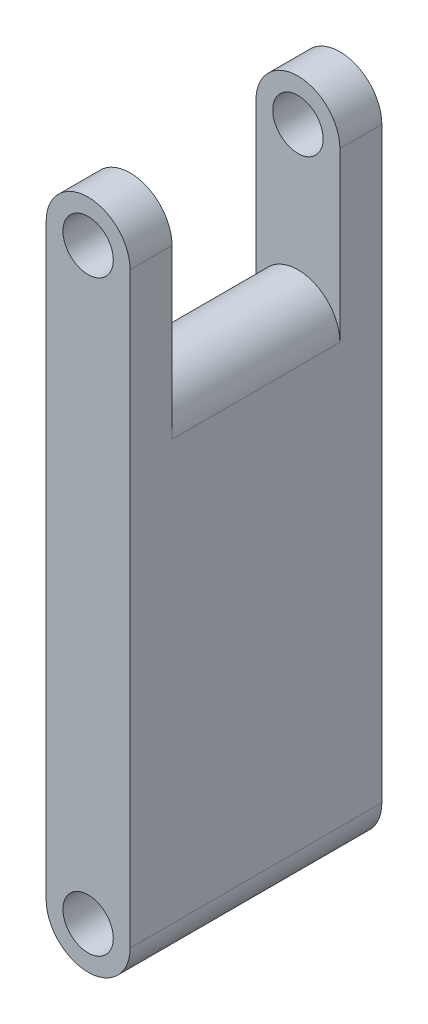
ISO-10303-21;
HEADER;
FILE_DESCRIPTION(('STEP AP214'),'2;1');
FILE_NAME('part.step','',(''),(''),'','','');
FILE_SCHEMA(('AUTOMOTIVE_DESIGN { 1 0 10303 214 1 1 1 1 }'));
ENDSEC;
DATA;
#1=APPLICATION_CONTEXT('core data for automotive mechanical design processes');
#2=APPLICATION_PROTOCOL_DEFINITION('international standard','automotive_design',2000,#1);
#3=PRODUCT_CONTEXT('',#1,'mechanical');
#4=PRODUCT('Part','Part','',(#3));
#5=PRODUCT_RELATED_PRODUCT_CATEGORY('part','',(#4));
#6=PRODUCT_DEFINITION_FORMATION('','',#4);
#7=PRODUCT_DEFINITION_CONTEXT('part definition',#1,'design');
#8=PRODUCT_DEFINITION('design','',#6,#7);
#9=PRODUCT_DEFINITION_SHAPE('','',#8);
#10=(LENGTH_UNIT() NAMED_UNIT(*) SI_UNIT(.MILLI.,.METRE.));
#11=(NAMED_UNIT(*) PLANE_ANGLE_UNIT() SI_UNIT($,.RADIAN.));
#12=(NAMED_UNIT(*) SI_UNIT($,.STERADIAN.) SOLID_ANGLE_UNIT());
#13=UNCERTAINTY_MEASURE_WITH_UNIT(LENGTH_MEASURE(1.E-05),#10,'distance_accuracy_value','');
#14=(GEOMETRIC_REPRESENTATION_CONTEXT(3) GLOBAL_UNCERTAINTY_ASSIGNED_CONTEXT((#13)) GLOBAL_UNIT_ASSIGNED_CONTEXT((#10,
#11,#12)) REPRESENTATION_CONTEXT('',''));
#15=CARTESIAN_POINT('',(0.,0.,0.));
#16=DIRECTION('',(0.,0.,1.));
#17=DIRECTION('',(1.,0.,0.));
#18=AXIS2_PLACEMENT_3D('',#15,#16,#17);
#19=CARTESIAN_POINT('',(0.,19.05,19.05));
#20=DIRECTION('',(0.,0.,1.));
#21=DIRECTION('',(1.,0.,0.));
#22=AXIS2_PLACEMENT_3D('',#19,#20,#21);
#23=CYLINDRICAL_SURFACE('',#22,6.35);
#24=DIRECTION('',(0.,0.,1.));
#25=VECTOR('',#24,1.);
#26=CARTESIAN_POINT('',(-6.35,19.05,19.05));
#27=LINE('',#26,#25);
#28=CARTESIAN_POINT('',(-6.35,19.05,12.7));
#29=VERTEX_POINT('',#28);
#30=CARTESIAN_POINT('',(-6.35,19.05,-12.7));
#31=VERTEX_POINT('',#30);
#32=EDGE_CURVE('E134',#29,#31,#27,.F.);
#33=ORIENTED_EDGE('',*,*,#32,.F.);
#34=CARTESIAN_POINT('',(0.,19.05,12.7));
#35=DIRECTION('',(0.,0.,1.));
#36=DIRECTION('',(0.,-1.,0.));
#37=AXIS2_PLACEMENT_3D('',#34,#35,#36);
#38=CIRCLE('',#37,6.35);
#39=CARTESIAN_POINT('',(6.35,19.05,12.7));
#40=VERTEX_POINT('',#39);
#41=EDGE_CURVE('E11',#40,#29,#38,.T.);
#42=ORIENTED_EDGE('',*,*,#41,.F.);
#43=DIRECTION('',(0.,0.,1.));
#44=VECTOR('',#43,1.);
#45=CARTESIAN_POINT('',(6.35,19.05,19.05));
#46=LINE('',#45,#44);
#47=CARTESIAN_POINT('',(6.35,19.05,-12.7));
#48=VERTEX_POINT('',#47);
#49=EDGE_CURVE('E142',#48,#40,#46,.T.);
#50=ORIENTED_EDGE('',*,*,#49,.F.);
#51=CARTESIAN_POINT('',(0.,19.05,-12.7));
#52=DIRECTION('',(0.,0.,-1.));
#53=DIRECTION('',(-1.,0.,0.));
#54=AXIS2_PLACEMENT_3D('',#51,#52,#53);
#55=CIRCLE('',#54,6.35);
#56=EDGE_CURVE('E44',#31,#48,#55,.T.);
#57=ORIENTED_EDGE('',*,*,#56,.F.);
#58=EDGE_LOOP('',(#33,#42,#50,#57));
#59=FACE_BOUND('',#58,.T.);
#60=ADVANCED_FACE('F36',(#59),#23,.T.);
#61=CARTESIAN_POINT('',(0.,44.45,19.05));
#62=DIRECTION('',(0.,0.,-1.));
#63=DIRECTION('',(-1.,0.,0.));
#64=AXIS2_PLACEMENT_3D('',#61,#62,#63);
#65=CYLINDRICAL_SURFACE('',#64,6.35);
#66=CARTESIAN_POINT('',(0.,44.45,12.7));
#67=DIRECTION('',(0.,0.,1.));
#68=DIRECTION('',(0.,-1.,0.));
#69=AXIS2_PLACEMENT_3D('',#66,#67,#68);
#70=CIRCLE('',#69,6.35);
#71=CARTESIAN_POINT('',(-6.35000000000001,44.45,12.7));
#72=VERTEX_POINT('',#71);
#73=CARTESIAN_POINT('',(6.35000000000001,44.45,12.7));
#74=VERTEX_POINT('',#73);
#75=EDGE_CURVE('E139',#72,#74,#70,.F.);
#76=ORIENTED_EDGE('',*,*,#75,.F.);
#77=DIRECTION('',(0.,0.,-1.));
#78=VECTOR('',#77,1.);
#79=CARTESIAN_POINT('',(-6.35000000000001,44.45,19.05));
#80=LINE('',#79,#78);
#81=CARTESIAN_POINT('',(-6.35000000000001,44.45,19.05));
#82=VERTEX_POINT('',#81);
#83=EDGE_CURVE('E129',#82,#72,#80,.T.);
#84=ORIENTED_EDGE('',*,*,#83,.F.);
#85=CARTESIAN_POINT('',(0.,44.45,19.05));
#86=DIRECTION('',(0.,0.,1.));
#87=DIRECTION('',(1.,0.,0.));
#88=AXIS2_PLACEMENT_3D('',#85,#86,#87);
#89=CIRCLE('',#88,6.35);
#90=CARTESIAN_POINT('',(6.34999999999999,44.45,19.05));
#91=VERTEX_POINT('',#90);
#92=EDGE_CURVE('E124',#91,#82,#89,.T.);
#93=ORIENTED_EDGE('',*,*,#92,.F.);
#94=DIRECTION('',(0.,0.,-1.));
#95=VECTOR('',#94,1.);
#96=CARTESIAN_POINT('',(6.34999999999999,44.45,19.05));
#97=LINE('',#96,#95);
#98=EDGE_CURVE('E125',#74,#91,#97,.F.);
#99=ORIENTED_EDGE('',*,*,#98,.F.);
#100=EDGE_LOOP('',(#76,#84,#93,#99));
#101=FACE_BOUND('',#100,.T.);
#102=ADVANCED_FACE('F155',(#101),#65,.T.);
#103=CARTESIAN_POINT('',(0.,44.45,-19.05));
#104=DIRECTION('',(0.,0.,1.));
#105=DIRECTION('',(1.,0.,0.));
#106=AXIS2_PLACEMENT_3D('',#103,#104,#105);
#107=CYLINDRICAL_SURFACE('',#106,3.81);
#108=CARTESIAN_POINT('',(0.,44.45,12.7));
#109=DIRECTION('',(0.,0.,1.));
#110=DIRECTION('',(0.,-1.,0.));
#111=AXIS2_PLACEMENT_3D('',#108,#109,#110);
#112=CIRCLE('',#111,3.81);
#113=CARTESIAN_POINT('',(3.81,44.45,12.7));
#114=VERTEX_POINT('',#113);
#115=EDGE_CURVE('E117',#114,#114,#112,.T.);
#116=CARTESIAN_POINT('',(0.,44.45,19.05));
#117=DIRECTION('',(0.,0.,-1.));
#118=DIRECTION('',(1.,0.,0.));
#119=AXIS2_PLACEMENT_3D('',#116,#117,#118);
#120=CIRCLE('',#119,3.81);
#121=CARTESIAN_POINT('',(3.81,44.45,19.05));
#122=VERTEX_POINT('',#121);
#123=EDGE_CURVE('E158',#122,#122,#120,.T.);
#124=CARTESIAN_POINT('',(3.81,44.45,12.7));
#125=CARTESIAN_POINT('',(3.81,44.45,12.7661458333333));
#126=CARTESIAN_POINT('',(3.81,44.45,12.8322916666667));
#127=CARTESIAN_POINT('',(3.81,44.45,12.9645833333333));
#128=CARTESIAN_POINT('',(3.81,44.45,13.0307291666667));
#129=CARTESIAN_POINT('',(3.81,44.45,13.1630208333333));
#130=CARTESIAN_POINT('',(3.81,44.45,13.2291666666667));
#131=CARTESIAN_POINT('',(3.81,44.45,13.3614583333333));
#132=CARTESIAN_POINT('',(3.81,44.45,13.4276041666667));
#133=CARTESIAN_POINT('',(3.81,44.45,13.5598958333333));
#134=CARTESIAN_POINT('',(3.81,44.45,13.6260416666667));
#135=CARTESIAN_POINT('',(3.81,44.45,13.7583333333333));
#136=CARTESIAN_POINT('',(3.81,44.45,13.8244791666667));
#137=CARTESIAN_POINT('',(3.81,44.45,13.9567708333333));
#138=CARTESIAN_POINT('',(3.81,44.45,14.0229166666667));
#139=CARTESIAN_POINT('',(3.81,44.45,14.1552083333333));
#140=CARTESIAN_POINT('',(3.81,44.45,14.2213541666667));
#141=CARTESIAN_POINT('',(3.81,44.45,14.3536458333333));
#142=CARTESIAN_POINT('',(3.81,44.45,14.4197916666667));
#143=CARTESIAN_POINT('',(3.81,44.45,14.5520833333333));
#144=CARTESIAN_POINT('',(3.81,44.45,14.6182291666667));
#145=CARTESIAN_POINT('',(3.81,44.45,14.7505208333333));
#146=CARTESIAN_POINT('',(3.81,44.45,14.8166666666667));
#147=CARTESIAN_POINT('',(3.81,44.45,14.9489583333333));
#148=CARTESIAN_POINT('',(3.81,44.45,15.0151041666667));
#149=CARTESIAN_POINT('',(3.81,44.45,15.1473958333333));
#150=CARTESIAN_POINT('',(3.81,44.45,15.2135416666667));
#151=CARTESIAN_POINT('',(3.81,44.45,15.3458333333333));
#152=CARTESIAN_POINT('',(3.81,44.45,15.4119791666667));
#153=CARTESIAN_POINT('',(3.81,44.45,15.5442708333333));
#154=CARTESIAN_POINT('',(3.81,44.45,15.6104166666667));
#155=CARTESIAN_POINT('',(3.81,44.45,15.7427083333333));
#156=CARTESIAN_POINT('',(3.81,44.45,15.8088541666667));
#157=CARTESIAN_POINT('',(3.81,44.45,15.9411458333333));
#158=CARTESIAN_POINT('',(3.81,44.45,16.0072916666667));
#159=CARTESIAN_POINT('',(3.81,44.45,16.1395833333333));
#160=CARTESIAN_POINT('',(3.81,44.45,16.2057291666667));
#161=CARTESIAN_POINT('',(3.81,44.45,16.3380208333333));
#162=CARTESIAN_POINT('',(3.81,44.45,16.4041666666667));
#163=CARTESIAN_POINT('',(3.81,44.45,16.5364583333333));
#164=CARTESIAN_POINT('',(3.81,44.45,16.6026041666667));
#165=CARTESIAN_POINT('',(3.81,44.45,16.7348958333333));
#166=CARTESIAN_POINT('',(3.81,44.45,16.8010416666667));
#167=CARTESIAN_POINT('',(3.81,44.45,16.9333333333333));
#168=CARTESIAN_POINT('',(3.81,44.45,16.9994791666667));
#169=CARTESIAN_POINT('',(3.81,44.45,17.1317708333333));
#170=CARTESIAN_POINT('',(3.81,44.45,17.1979166666667));
#171=CARTESIAN_POINT('',(3.81,44.45,17.3302083333333));
#172=CARTESIAN_POINT('',(3.81,44.45,17.3963541666667));
#173=CARTESIAN_POINT('',(3.81,44.45,17.5286458333333));
#174=CARTESIAN_POINT('',(3.81,44.45,17.5947916666667));
#175=CARTESIAN_POINT('',(3.81,44.45,17.7270833333333));
#176=CARTESIAN_POINT('',(3.81,44.45,17.7932291666667));
#177=CARTESIAN_POINT('',(3.81,44.45,17.9255208333333));
#178=CARTESIAN_POINT('',(3.81,44.45,17.9916666666667));
#179=CARTESIAN_POINT('',(3.81,44.45,18.1239583333333));
#180=CARTESIAN_POINT('',(3.81,44.45,18.1901041666667));
#181=CARTESIAN_POINT('',(3.81,44.45,18.3223958333333));
#182=CARTESIAN_POINT('',(3.81,44.45,18.3885416666667));
#183=CARTESIAN_POINT('',(3.81,44.45,18.5208333333333));
#184=CARTESIAN_POINT('',(3.81,44.45,18.5869791666667));
#185=CARTESIAN_POINT('',(3.81,44.45,18.7192708333333));
#186=CARTESIAN_POINT('',(3.81,44.45,18.7854166666667));
#187=CARTESIAN_POINT('',(3.81,44.45,18.9177083333333));
#188=CARTESIAN_POINT('',(3.81,44.45,18.9838541666667));
#189=CARTESIAN_POINT('',(3.81,44.45,19.05));
#190=B_SPLINE_CURVE_WITH_KNOTS('',3,(#124,#125,#126,#127,#128,#129,#130,#131,#132,#133,#134,
#135,#136,#137,#138,#139,#140,#141,#142,#143,#144,#145,#146,#147,#148,#149,#150,#151,#152,#153,
#154,#155,#156,#157,#158,#159,#160,#161,#162,#163,#164,#165,#166,#167,#168,#169,#170,#171,#172,
#173,#174,#175,#176,#177,#178,#179,#180,#181,#182,#183,#184,#185,#186,#187,#188,#189),
.UNSPECIFIED.,.F.,.F.,(4,2,2,2,2,2,2,2,2,2,2,2,2,2,2,2,2,2,2,2,2,2,2,2,2,2,2,2,2,2,2,2,4),(0.,
0.198437500000002,0.396874999999998,0.5953125,0.793750000000003,0.992187499999998,1.190625,
1.3890625,1.58750000000001,1.7859375,1.984375,2.18281250000001,2.38125,2.5796875,
2.77812500000001,2.9765625,3.175,3.37343750000001,3.571875,3.7703125,3.96875000000001,4.1671875,
4.365625,4.56406250000001,4.7625,4.96093750000001,5.15937500000001,5.3578125,5.55625000000001,
5.75468750000001,5.95312500000001,6.15156250000001,6.35000000000001),.UNSPECIFIED.);
#191=EDGE_CURVE('BSEAM224',#114,#122,#190,.T.);
#192=ORIENTED_EDGE('',*,*,#115,.F.);
#193=ORIENTED_EDGE('',*,*,#123,.F.);
#194=ORIENTED_EDGE('',*,*,#191,.T.);
#195=ORIENTED_EDGE('',*,*,#191,.F.);
#196=EDGE_LOOP('',(#192,#194,#193,#195));
#197=FACE_BOUND('',#196,.T.);
#198=ADVANCED_FACE('F224',(#197),#107,.F.);
#199=CARTESIAN_POINT('',(0.,44.45,-12.7));
#200=DIRECTION('',(0.,0.,-1.));
#201=DIRECTION('',(-1.,0.,0.));
#202=AXIS2_PLACEMENT_3D('',#199,#200,#201);
#203=CIRCLE('',#202,6.35);
#204=CARTESIAN_POINT('',(6.35000000000001,44.45,-12.7));
#205=VERTEX_POINT('',#204);
#206=CARTESIAN_POINT('',(-6.35000000000001,44.45,-12.7));
#207=VERTEX_POINT('',#206);
#208=EDGE_CURVE('E103',#205,#207,#203,.F.);
#209=ORIENTED_EDGE('',*,*,#208,.F.);
#210=CARTESIAN_POINT('',(6.34999999999999,44.45,-19.05));
#211=VERTEX_POINT('',#210);
#212=EDGE_CURVE('E114',#211,#205,#97,.F.);
#213=ORIENTED_EDGE('',*,*,#212,.F.);
#214=CARTESIAN_POINT('',(0.,44.45,-19.05));
#215=DIRECTION('',(0.,0.,1.));
#216=DIRECTION('',(1.,0.,0.));
#217=AXIS2_PLACEMENT_3D('',#214,#215,#216);
#218=CIRCLE('',#217,6.35);
#219=CARTESIAN_POINT('',(-6.35000000000001,44.45,-19.05));
#220=VERTEX_POINT('',#219);
#221=EDGE_CURVE('E127',#220,#211,#218,.F.);
#222=ORIENTED_EDGE('',*,*,#221,.F.);
#223=EDGE_CURVE('E116',#207,#220,#80,.T.);
#224=ORIENTED_EDGE('',*,*,#223,.F.);
#225=EDGE_LOOP('',(#209,#213,#222,#224));
#226=FACE_BOUND('',#225,.T.);
#227=ADVANCED_FACE('F112',(#226),#65,.T.);
#228=CARTESIAN_POINT('',(0.,-44.45,-19.05));
#229=DIRECTION('',(0.,0.,-1.));
#230=DIRECTION('',(-1.,0.,0.));
#231=AXIS2_PLACEMENT_3D('',#228,#229,#230);
#232=CYLINDRICAL_SURFACE('',#231,6.35);
#233=DIRECTION('',(0.,0.,-1.));
#234=VECTOR('',#233,1.);
#235=CARTESIAN_POINT('',(-6.34999999999999,-44.45,19.05));
#236=LINE('',#235,#234);
#237=CARTESIAN_POINT('',(-6.34999999999999,-44.45,-19.05));
#238=VERTEX_POINT('',#237);
#239=CARTESIAN_POINT('',(-6.34999999999999,-44.45,19.05));
#240=VERTEX_POINT('',#239);
#241=EDGE_CURVE('E174',#238,#240,#236,.F.);
#242=ORIENTED_EDGE('',*,*,#241,.F.);
#243=CARTESIAN_POINT('',(0.,-44.45,-19.05));
#244=DIRECTION('',(0.,0.,1.));
#245=DIRECTION('',(1.,0.,0.));
#246=AXIS2_PLACEMENT_3D('',#243,#244,#245);
#247=CIRCLE('',#246,6.35);
#248=CARTESIAN_POINT('',(6.35,-44.45,-19.05));
#249=VERTEX_POINT('',#248);
#250=EDGE_CURVE('E164',#249,#238,#247,.F.);
#251=ORIENTED_EDGE('',*,*,#250,.F.);
#252=DIRECTION('',(0.,0.,-1.));
#253=VECTOR('',#252,1.);
#254=CARTESIAN_POINT('',(6.35,-44.45,19.05));
#255=LINE('',#254,#253);
#256=CARTESIAN_POINT('',(6.35,-44.45,19.05));
#257=VERTEX_POINT('',#256);
#258=EDGE_CURVE('E170',#257,#249,#255,.T.);
#259=ORIENTED_EDGE('',*,*,#258,.F.);
#260=CARTESIAN_POINT('',(0.,-44.45,19.05));
#261=DIRECTION('',(0.,0.,1.));
#262=DIRECTION('',(1.,0.,0.));
#263=AXIS2_PLACEMENT_3D('',#260,#261,#262);
#264=CIRCLE('',#263,6.35);
#265=EDGE_CURVE('E163',#240,#257,#264,.T.);
#266=ORIENTED_EDGE('',*,*,#265,.F.);
#267=EDGE_LOOP('',(#242,#251,#259,#266));
#268=FACE_BOUND('',#267,.T.);
#269=ADVANCED_FACE('F209',(#268),#232,.T.);
#270=CARTESIAN_POINT('',(6.34999999999999,50.8,19.05));
#271=DIRECTION('',(-1.,0.,0.));
#272=DIRECTION('',(0.,-1.,0.));
#273=AXIS2_PLACEMENT_3D('',#270,#271,#272);
#274=PLANE('',#273);
#275=ORIENTED_EDGE('',*,*,#49,.T.);
#276=DIRECTION('',(0.,1.,0.));
#277=VECTOR('',#276,1.);
#278=CARTESIAN_POINT('',(6.35000000000001,25.4,12.7));
#279=LINE('',#278,#277);
#280=EDGE_CURVE('E50',#40,#74,#279,.T.);
#281=ORIENTED_EDGE('',*,*,#280,.T.);
#282=ORIENTED_EDGE('',*,*,#98,.T.);
#283=DIRECTION('',(0.,1.,0.));
#284=VECTOR('',#283,1.);
#285=CARTESIAN_POINT('',(6.34999999999999,50.8,19.05));
#286=LINE('',#285,#284);
#287=EDGE_CURVE('E178',#257,#91,#286,.T.);
#288=ORIENTED_EDGE('',*,*,#287,.F.);
#289=ORIENTED_EDGE('',*,*,#258,.T.);
#290=DIRECTION('',(0.,1.,0.));
#291=VECTOR('',#290,1.);
#292=CARTESIAN_POINT('',(6.34999999999999,50.8,-19.05));
#293=LINE('',#292,#291);
#294=EDGE_CURVE('E123',#249,#211,#293,.T.);
#295=ORIENTED_EDGE('',*,*,#294,.T.);
#296=ORIENTED_EDGE('',*,*,#212,.T.);
#297=DIRECTION('',(0.,-1.,0.));
#298=VECTOR('',#297,1.);
#299=CARTESIAN_POINT('',(6.35000000000001,50.8,-12.7));
#300=LINE('',#299,#298);
#301=EDGE_CURVE('E58',#205,#48,#300,.T.);
#302=ORIENTED_EDGE('',*,*,#301,.T.);
#303=EDGE_LOOP('',(#275,#281,#282,#288,#289,#295,#296,#302));
#304=FACE_BOUND('',#303,.T.);
#305=ADVANCED_FACE('F120',(#304),#274,.F.);
#306=CARTESIAN_POINT('',(-6.35000000000001,50.8,19.05));
#307=DIRECTION('',(1.,0.,0.));
#308=DIRECTION('',(0.,1.,0.));
#309=AXIS2_PLACEMENT_3D('',#306,#307,#308);
#310=PLANE('',#309);
#311=DIRECTION('',(0.,1.,0.));
#312=VECTOR('',#311,1.);
#313=CARTESIAN_POINT('',(-6.35,25.4,12.7));
#314=LINE('',#313,#312);
#315=EDGE_CURVE('E107',#29,#72,#314,.T.);
#316=ORIENTED_EDGE('',*,*,#315,.F.);
#317=ORIENTED_EDGE('',*,*,#32,.T.);
#318=DIRECTION('',(0.,-1.,0.));
#319=VECTOR('',#318,1.);
#320=CARTESIAN_POINT('',(-6.35000000000001,50.8,-12.7));
#321=LINE('',#320,#319);
#322=EDGE_CURVE('E151',#207,#31,#321,.T.);
#323=ORIENTED_EDGE('',*,*,#322,.F.);
#324=ORIENTED_EDGE('',*,*,#223,.T.);
#325=DIRECTION('',(0.,-1.,0.));
#326=VECTOR('',#325,1.);
#327=CARTESIAN_POINT('',(-6.35000000000001,50.8,-19.05));
#328=LINE('',#327,#326);
#329=EDGE_CURVE('E176',#220,#238,#328,.T.);
#330=ORIENTED_EDGE('',*,*,#329,.T.);
#331=ORIENTED_EDGE('',*,*,#241,.T.);
#332=DIRECTION('',(0.,-1.,0.));
#333=VECTOR('',#332,1.);
#334=CARTESIAN_POINT('',(-6.35000000000001,50.8,19.05));
#335=LINE('',#334,#333);
#336=EDGE_CURVE('E162',#82,#240,#335,.T.);
#337=ORIENTED_EDGE('',*,*,#336,.F.);
#338=ORIENTED_EDGE('',*,*,#83,.T.);
#339=EDGE_LOOP('',(#316,#317,#323,#324,#330,#331,#337,#338));
#340=FACE_BOUND('',#339,.T.);
#341=ADVANCED_FACE('F160',(#340),#310,.F.);
#342=CARTESIAN_POINT('',(0.,0.,19.05));
#343=DIRECTION('',(0.,0.,1.));
#344=DIRECTION('',(1.,0.,0.));
#345=AXIS2_PLACEMENT_3D('',#342,#343,#344);
#346=PLANE('',#345);
#347=ORIENTED_EDGE('',*,*,#123,.T.);
#348=EDGE_LOOP('',(#347));
#349=FACE_BOUND('',#348,.T.);
#350=CARTESIAN_POINT('',(0.,-44.45,19.05));
#351=DIRECTION('',(0.,0.,1.));
#352=DIRECTION('',(1.,0.,0.));
#353=AXIS2_PLACEMENT_3D('',#350,#351,#352);
#354=CIRCLE('',#353,3.81);
#355=CARTESIAN_POINT('',(3.81,-44.45,19.05));
#356=VERTEX_POINT('',#355);
#357=EDGE_CURVE('E183',#356,#356,#354,.T.);
#358=ORIENTED_EDGE('',*,*,#357,.F.);
#359=EDGE_LOOP('',(#358));
#360=FACE_BOUND('',#359,.T.);
#361=ORIENTED_EDGE('',*,*,#287,.T.);
#362=ORIENTED_EDGE('',*,*,#92,.T.);
#363=ORIENTED_EDGE('',*,*,#336,.T.);
#364=ORIENTED_EDGE('',*,*,#265,.T.);
#365=EDGE_LOOP('',(#361,#362,#363,#364));
#366=FACE_BOUND('',#365,.T.);
#367=ADVANCED_FACE('F202',(#349,#360,#366),#346,.T.);
#368=CARTESIAN_POINT('',(0.,0.,-19.05));
#369=DIRECTION('',(0.,0.,1.));
#370=DIRECTION('',(1.,0.,0.));
#371=AXIS2_PLACEMENT_3D('',#368,#369,#370);
#372=PLANE('',#371);
#373=CARTESIAN_POINT('',(0.,44.45,-19.05));
#374=DIRECTION('',(0.,0.,-1.));
#375=DIRECTION('',(1.,0.,0.));
#376=AXIS2_PLACEMENT_3D('',#373,#374,#375);
#377=CIRCLE('',#376,3.81);
#378=CARTESIAN_POINT('',(3.81,44.45,-19.05));
#379=VERTEX_POINT('',#378);
#380=EDGE_CURVE('E186',#379,#379,#377,.T.);
#381=ORIENTED_EDGE('',*,*,#380,.F.);
#382=EDGE_LOOP('',(#381));
#383=FACE_BOUND('',#382,.T.);
#384=CARTESIAN_POINT('',(0.,-44.45,-19.05));
#385=DIRECTION('',(0.,0.,1.));
#386=DIRECTION('',(1.,0.,0.));
#387=AXIS2_PLACEMENT_3D('',#384,#385,#386);
#388=CIRCLE('',#387,3.81);
#389=CARTESIAN_POINT('',(3.81,-44.45,-19.05));
#390=VERTEX_POINT('',#389);
#391=EDGE_CURVE('E180',#390,#390,#388,.T.);
#392=ORIENTED_EDGE('',*,*,#391,.T.);
#393=EDGE_LOOP('',(#392));
#394=FACE_BOUND('',#393,.T.);
#395=ORIENTED_EDGE('',*,*,#329,.F.);
#396=ORIENTED_EDGE('',*,*,#221,.T.);
#397=ORIENTED_EDGE('',*,*,#294,.F.);
#398=ORIENTED_EDGE('',*,*,#250,.T.);
#399=EDGE_LOOP('',(#395,#396,#397,#398));
#400=FACE_BOUND('',#399,.T.);
#401=ADVANCED_FACE('F198',(#383,#394,#400),#372,.F.);
#402=CARTESIAN_POINT('',(0.,-44.45,-19.05));
#403=DIRECTION('',(0.,0.,1.));
#404=DIRECTION('',(1.,0.,0.));
#405=AXIS2_PLACEMENT_3D('',#402,#403,#404);
#406=CYLINDRICAL_SURFACE('',#405,3.81);
#407=CARTESIAN_POINT('',(3.81,-44.45,-19.05));
#408=CARTESIAN_POINT('',(3.81,-44.45,-18.653125));
#409=CARTESIAN_POINT('',(3.81,-44.45,-18.25625));
#410=CARTESIAN_POINT('',(3.81,-44.45,-17.4625));
#411=CARTESIAN_POINT('',(3.81,-44.45,-17.065625));
#412=CARTESIAN_POINT('',(3.81,-44.45,-16.271875));
#413=CARTESIAN_POINT('',(3.81,-44.45,-15.875));
#414=CARTESIAN_POINT('',(3.81,-44.45,-15.08125));
#415=CARTESIAN_POINT('',(3.81,-44.45,-14.684375));
#416=CARTESIAN_POINT('',(3.81,-44.45,-13.890625));
#417=CARTESIAN_POINT('',(3.81,-44.45,-13.49375));
#418=CARTESIAN_POINT('',(3.81,-44.45,-12.7));
#419=CARTESIAN_POINT('',(3.81,-44.45,-12.303125));
#420=CARTESIAN_POINT('',(3.81,-44.45,-11.509375));
#421=CARTESIAN_POINT('',(3.81,-44.45,-11.1125));
#422=CARTESIAN_POINT('',(3.81,-44.45,-10.31875));
#423=CARTESIAN_POINT('',(3.81,-44.45,-9.921875));
#424=CARTESIAN_POINT('',(3.81,-44.45,-9.128125));
#425=CARTESIAN_POINT('',(3.81,-44.45,-8.73125));
#426=CARTESIAN_POINT('',(3.81,-44.45,-7.9375));
#427=CARTESIAN_POINT('',(3.81,-44.45,-7.540625));
#428=CARTESIAN_POINT('',(3.81,-44.45,-6.746875));
#429=CARTESIAN_POINT('',(3.81,-44.45,-6.35));
#430=CARTESIAN_POINT('',(3.81,-44.45,-5.55625));
#431=CARTESIAN_POINT('',(3.81,-44.45,-5.159375));
#432=CARTESIAN_POINT('',(3.81,-44.45,-4.365625));
#433=CARTESIAN_POINT('',(3.81,-44.45,-3.96875));
#434=CARTESIAN_POINT('',(3.81,-44.45,-3.175));
#435=CARTESIAN_POINT('',(3.81,-44.45,-2.778125));
#436=CARTESIAN_POINT('',(3.81,-44.45,-1.984375));
#437=CARTESIAN_POINT('',(3.81,-44.45,-1.5875));
#438=CARTESIAN_POINT('',(3.81,-44.45,-0.793750000000004));
#439=CARTESIAN_POINT('',(3.81,-44.45,-0.396875000000004));
#440=CARTESIAN_POINT('',(3.81,-44.45,0.396874999999997));
#441=CARTESIAN_POINT('',(3.81,-44.45,0.793749999999997));
#442=CARTESIAN_POINT('',(3.81,-44.45,1.5875));
#443=CARTESIAN_POINT('',(3.81,-44.45,1.984375));
#444=CARTESIAN_POINT('',(3.81,-44.45,2.778125));
#445=CARTESIAN_POINT('',(3.81,-44.45,3.175));
#446=CARTESIAN_POINT('',(3.81,-44.45,3.96875));
#447=CARTESIAN_POINT('',(3.81,-44.45,4.365625));
#448=CARTESIAN_POINT('',(3.81,-44.45,5.159375));
#449=CARTESIAN_POINT('',(3.81,-44.45,5.55625));
#450=CARTESIAN_POINT('',(3.81,-44.45,6.35));
#451=CARTESIAN_POINT('',(3.81,-44.45,6.746875));
#452=CARTESIAN_POINT('',(3.81,-44.45,7.540625));
#453=CARTESIAN_POINT('',(3.81,-44.45,7.9375));
#454=CARTESIAN_POINT('',(3.81,-44.45,8.73125));
#455=CARTESIAN_POINT('',(3.81,-44.45,9.128125));
#456=CARTESIAN_POINT('',(3.81,-44.45,9.921875));
#457=CARTESIAN_POINT('',(3.81,-44.45,10.31875));
#458=CARTESIAN_POINT('',(3.81,-44.45,11.1125));
#459=CARTESIAN_POINT('',(3.81,-44.45,11.509375));
#460=CARTESIAN_POINT('',(3.81,-44.45,12.303125));
#461=CARTESIAN_POINT('',(3.81,-44.45,12.7));
#462=CARTESIAN_POINT('',(3.81,-44.45,13.49375));
#463=CARTESIAN_POINT('',(3.81,-44.45,13.890625));
#464=CARTESIAN_POINT('',(3.81,-44.45,14.684375));
#465=CARTESIAN_POINT('',(3.81,-44.45,15.08125));
#466=CARTESIAN_POINT('',(3.81,-44.45,15.875));
#467=CARTESIAN_POINT('',(3.81,-44.45,16.271875));
#468=CARTESIAN_POINT('',(3.81,-44.45,17.065625));
#469=CARTESIAN_POINT('',(3.81,-44.45,17.4625));
#470=CARTESIAN_POINT('',(3.81,-44.45,18.25625));
#471=CARTESIAN_POINT('',(3.81,-44.45,18.653125));
#472=CARTESIAN_POINT('',(3.81,-44.45,19.05));
#473=B_SPLINE_CURVE_WITH_KNOTS('',3,(#407,#408,#409,#410,#411,#412,#413,#414,#415,#416,#417,
#418,#419,#420,#421,#422,#423,#424,#425,#426,#427,#428,#429,#430,#431,#432,#433,#434,#435,#436,
#437,#438,#439,#440,#441,#442,#443,#444,#445,#446,#447,#448,#449,#450,#451,#452,#453,#454,#455,
#456,#457,#458,#459,#460,#461,#462,#463,#464,#465,#466,#467,#468,#469,#470,#471,#472),
.UNSPECIFIED.,.F.,.F.,(4,2,2,2,2,2,2,2,2,2,2,2,2,2,2,2,2,2,2,2,2,2,2,2,2,2,2,2,2,2,2,2,4),(0.,
1.190625,2.38125,3.571875,4.7625,5.953125,7.14375,8.334375,9.525,10.715625,11.90625,13.096875,
14.2875,15.478125,16.66875,17.859375,19.05,20.240625,21.43125,22.621875,23.8125,25.003125,
26.19375,27.384375,28.575,29.765625,30.95625,32.146875,33.3375,34.528125,35.71875,36.909375,
38.1),.UNSPECIFIED.);
#474=EDGE_CURVE('BSEAM201',#390,#356,#473,.T.);
#475=ORIENTED_EDGE('',*,*,#391,.F.);
#476=ORIENTED_EDGE('',*,*,#357,.T.);
#477=ORIENTED_EDGE('',*,*,#474,.T.);
#478=ORIENTED_EDGE('',*,*,#474,.F.);
#479=EDGE_LOOP('',(#475,#477,#476,#478));
#480=FACE_BOUND('',#479,.T.);
#481=ADVANCED_FACE('F201',(#480),#406,.F.);
#482=CARTESIAN_POINT('',(0.,44.45,-12.7));
#483=DIRECTION('',(0.,0.,-1.));
#484=DIRECTION('',(-1.,0.,0.));
#485=AXIS2_PLACEMENT_3D('',#482,#483,#484);
#486=CIRCLE('',#485,3.81);
#487=CARTESIAN_POINT('',(3.81,44.45,-12.7));
#488=VERTEX_POINT('',#487);
#489=EDGE_CURVE('E118',#488,#488,#486,.T.);
#490=CARTESIAN_POINT('',(3.81,44.45,-12.7));
#491=CARTESIAN_POINT('',(3.81,44.45,-12.7661458333333));
#492=CARTESIAN_POINT('',(3.81,44.45,-12.8322916666667));
#493=CARTESIAN_POINT('',(3.81,44.45,-12.9645833333333));
#494=CARTESIAN_POINT('',(3.81,44.45,-13.0307291666667));
#495=CARTESIAN_POINT('',(3.81,44.45,-13.1630208333333));
#496=CARTESIAN_POINT('',(3.81,44.45,-13.2291666666667));
#497=CARTESIAN_POINT('',(3.81,44.45,-13.3614583333333));
#498=CARTESIAN_POINT('',(3.81,44.45,-13.4276041666667));
#499=CARTESIAN_POINT('',(3.81,44.45,-13.5598958333333));
#500=CARTESIAN_POINT('',(3.81,44.45,-13.6260416666667));
#501=CARTESIAN_POINT('',(3.81,44.45,-13.7583333333333));
#502=CARTESIAN_POINT('',(3.81,44.45,-13.8244791666667));
#503=CARTESIAN_POINT('',(3.81,44.45,-13.9567708333333));
#504=CARTESIAN_POINT('',(3.81,44.45,-14.0229166666667));
#505=CARTESIAN_POINT('',(3.81,44.45,-14.1552083333333));
#506=CARTESIAN_POINT('',(3.81,44.45,-14.2213541666667));
#507=CARTESIAN_POINT('',(3.81,44.45,-14.3536458333333));
#508=CARTESIAN_POINT('',(3.81,44.45,-14.4197916666667));
#509=CARTESIAN_POINT('',(3.81,44.45,-14.5520833333333));
#510=CARTESIAN_POINT('',(3.81,44.45,-14.6182291666667));
#511=CARTESIAN_POINT('',(3.81,44.45,-14.7505208333333));
#512=CARTESIAN_POINT('',(3.81,44.45,-14.8166666666667));
#513=CARTESIAN_POINT('',(3.81,44.45,-14.9489583333333));
#514=CARTESIAN_POINT('',(3.81,44.45,-15.0151041666667));
#515=CARTESIAN_POINT('',(3.81,44.45,-15.1473958333333));
#516=CARTESIAN_POINT('',(3.81,44.45,-15.2135416666667));
#517=CARTESIAN_POINT('',(3.81,44.45,-15.3458333333333));
#518=CARTESIAN_POINT('',(3.81,44.45,-15.4119791666667));
#519=CARTESIAN_POINT('',(3.81,44.45,-15.5442708333333));
#520=CARTESIAN_POINT('',(3.81,44.45,-15.6104166666667));
#521=CARTESIAN_POINT('',(3.81,44.45,-15.7427083333333));
#522=CARTESIAN_POINT('',(3.81,44.45,-15.8088541666667));
#523=CARTESIAN_POINT('',(3.81,44.45,-15.9411458333333));
#524=CARTESIAN_POINT('',(3.81,44.45,-16.0072916666667));
#525=CARTESIAN_POINT('',(3.81,44.45,-16.1395833333333));
#526=CARTESIAN_POINT('',(3.81,44.45,-16.2057291666667));
#527=CARTESIAN_POINT('',(3.81,44.45,-16.3380208333333));
#528=CARTESIAN_POINT('',(3.81,44.45,-16.4041666666667));
#529=CARTESIAN_POINT('',(3.81,44.45,-16.5364583333333));
#530=CARTESIAN_POINT('',(3.81,44.45,-16.6026041666667));
#531=CARTESIAN_POINT('',(3.81,44.45,-16.7348958333333));
#532=CARTESIAN_POINT('',(3.81,44.45,-16.8010416666667));
#533=CARTESIAN_POINT('',(3.81,44.45,-16.9333333333333));
#534=CARTESIAN_POINT('',(3.81,44.45,-16.9994791666667));
#535=CARTESIAN_POINT('',(3.81,44.45,-17.1317708333333));
#536=CARTESIAN_POINT('',(3.81,44.45,-17.1979166666667));
#537=CARTESIAN_POINT('',(3.81,44.45,-17.3302083333333));
#538=CARTESIAN_POINT('',(3.81,44.45,-17.3963541666667));
#539=CARTESIAN_POINT('',(3.81,44.45,-17.5286458333333));
#540=CARTESIAN_POINT('',(3.81,44.45,-17.5947916666667));
#541=CARTESIAN_POINT('',(3.81,44.45,-17.7270833333333));
#542=CARTESIAN_POINT('',(3.81,44.45,-17.7932291666667));
#543=CARTESIAN_POINT('',(3.81,44.45,-17.9255208333333));
#544=CARTESIAN_POINT('',(3.81,44.45,-17.9916666666667));
#545=CARTESIAN_POINT('',(3.81,44.45,-18.1239583333333));
#546=CARTESIAN_POINT('',(3.81,44.45,-18.1901041666667));
#547=CARTESIAN_POINT('',(3.81,44.45,-18.3223958333333));
#548=CARTESIAN_POINT('',(3.81,44.45,-18.3885416666667));
#549=CARTESIAN_POINT('',(3.81,44.45,-18.5208333333333));
#550=CARTESIAN_POINT('',(3.81,44.45,-18.5869791666667));
#551=CARTESIAN_POINT('',(3.81,44.45,-18.7192708333333));
#552=CARTESIAN_POINT('',(3.81,44.45,-18.7854166666667));
#553=CARTESIAN_POINT('',(3.81,44.45,-18.9177083333333));
#554=CARTESIAN_POINT('',(3.81,44.45,-18.9838541666667));
#555=CARTESIAN_POINT('',(3.81,44.45,-19.05));
#556=B_SPLINE_CURVE_WITH_KNOTS('',3,(#490,#491,#492,#493,#494,#495,#496,#497,#498,#499,#500,
#501,#502,#503,#504,#505,#506,#507,#508,#509,#510,#511,#512,#513,#514,#515,#516,#517,#518,#519,
#520,#521,#522,#523,#524,#525,#526,#527,#528,#529,#530,#531,#532,#533,#534,#535,#536,#537,#538,
#539,#540,#541,#542,#543,#544,#545,#546,#547,#548,#549,#550,#551,#552,#553,#554,#555),
.UNSPECIFIED.,.F.,.F.,(4,2,2,2,2,2,2,2,2,2,2,2,2,2,2,2,2,2,2,2,2,2,2,2,2,2,2,2,2,2,2,2,4),(0.,
0.198437499999999,0.396874999999998,0.5953125,0.793749999999999,0.992187499999998,1.190625,
1.3890625,1.5875,1.7859375,1.984375,2.1828125,2.38125,2.5796875,2.778125,2.9765625,3.175,
3.3734375,3.571875,3.7703125,3.96875,4.1671875,4.365625,4.5640625,4.7625,4.9609375,5.159375,
5.3578125,5.55625,5.7546875,5.953125,6.1515625,6.35),.UNSPECIFIED.);
#557=EDGE_CURVE('BSEAM196',#488,#379,#556,.T.);
#558=ORIENTED_EDGE('',*,*,#489,.F.);
#559=ORIENTED_EDGE('',*,*,#380,.T.);
#560=ORIENTED_EDGE('',*,*,#557,.T.);
#561=ORIENTED_EDGE('',*,*,#557,.F.);
#562=EDGE_LOOP('',(#558,#560,#559,#561));
#563=FACE_BOUND('',#562,.T.);
#564=ADVANCED_FACE('F196',(#563),#107,.F.);
#565=CARTESIAN_POINT('',(6.35000000000001,25.4,12.7));
#566=DIRECTION('',(0.,0.,1.));
#567=DIRECTION('',(0.,-1.,0.));
#568=AXIS2_PLACEMENT_3D('',#565,#566,#567);
#569=PLANE('',#568);
#570=ORIENTED_EDGE('',*,*,#75,.T.);
#571=ORIENTED_EDGE('',*,*,#280,.F.);
#572=ORIENTED_EDGE('',*,*,#41,.T.);
#573=ORIENTED_EDGE('',*,*,#315,.T.);
#574=EDGE_LOOP('',(#570,#571,#572,#573));
#575=FACE_BOUND('',#574,.T.);
#576=ORIENTED_EDGE('',*,*,#115,.T.);
#577=EDGE_LOOP('',(#576));
#578=FACE_BOUND('',#577,.T.);
#579=ADVANCED_FACE('F146',(#575,#578),#569,.F.);
#580=CARTESIAN_POINT('',(6.35000000000001,50.8,-12.7));
#581=DIRECTION('',(0.,0.,-1.));
#582=DIRECTION('',(-1.,0.,0.));
#583=AXIS2_PLACEMENT_3D('',#580,#581,#582);
#584=PLANE('',#583);
#585=ORIENTED_EDGE('',*,*,#208,.T.);
#586=ORIENTED_EDGE('',*,*,#322,.T.);
#587=ORIENTED_EDGE('',*,*,#56,.T.);
#588=ORIENTED_EDGE('',*,*,#301,.F.);
#589=EDGE_LOOP('',(#585,#586,#587,#588));
#590=FACE_BOUND('',#589,.T.);
#591=ORIENTED_EDGE('',*,*,#489,.T.);
#592=EDGE_LOOP('',(#591));
#593=FACE_BOUND('',#592,.T.);
#594=ADVANCED_FACE('F101',(#590,#593),#584,.F.);
#595=CLOSED_SHELL('',(#60,#102,#198,#227,#269,#305,#341,#367,#401,#481,#564,#579,#594));
#596=MANIFOLD_SOLID_BREP('B2',#595);
#597=ADVANCED_BREP_SHAPE_REPRESENTATION('',(#18,#596),#14);
#598=SHAPE_DEFINITION_REPRESENTATION(#9,#597);
ENDSEC;
END-ISO-10303-21;
